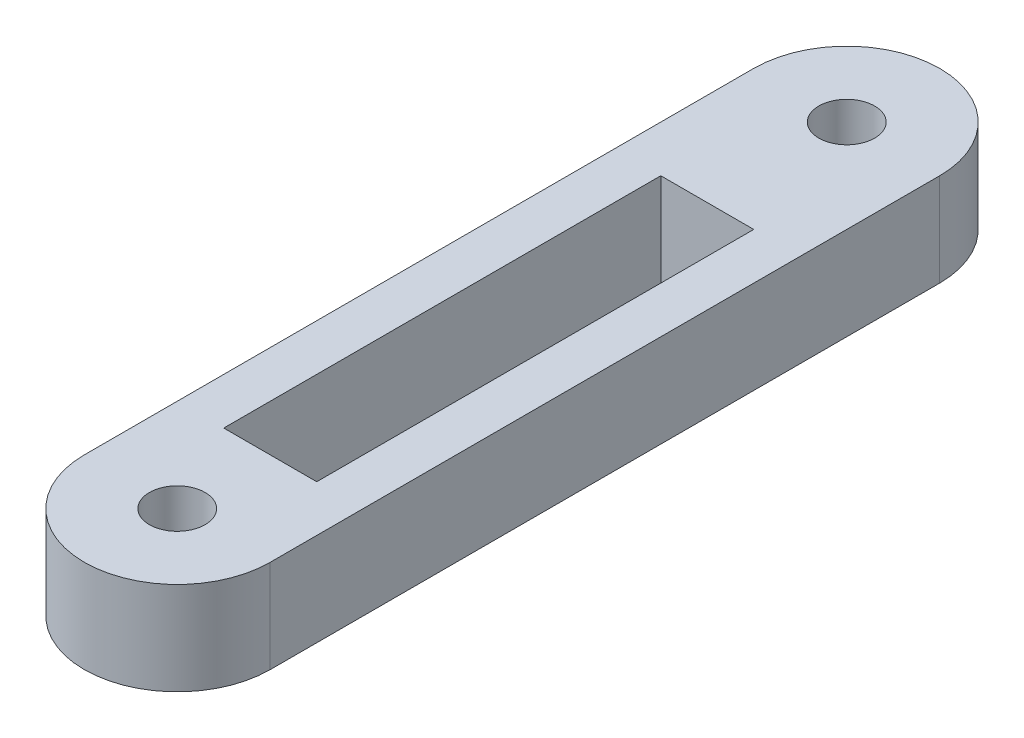
ISO-10303-21;
HEADER;
FILE_DESCRIPTION(('STEP AP214'),'2;1');
FILE_NAME('part.step','',(''),(''),'','','');
FILE_SCHEMA(('AUTOMOTIVE_DESIGN { 1 0 10303 214 1 1 1 1 }'));
ENDSEC;
DATA;
#1=APPLICATION_CONTEXT('core data for automotive mechanical design processes');
#2=APPLICATION_PROTOCOL_DEFINITION('international standard','automotive_design',2000,#1);
#3=PRODUCT_CONTEXT('',#1,'mechanical');
#4=PRODUCT('Part','Part','',(#3));
#5=PRODUCT_RELATED_PRODUCT_CATEGORY('part','',(#4));
#6=PRODUCT_DEFINITION_FORMATION('','',#4);
#7=PRODUCT_DEFINITION_CONTEXT('part definition',#1,'design');
#8=PRODUCT_DEFINITION('design','',#6,#7);
#9=PRODUCT_DEFINITION_SHAPE('','',#8);
#10=(LENGTH_UNIT() NAMED_UNIT(*) SI_UNIT(.MILLI.,.METRE.));
#11=(NAMED_UNIT(*) PLANE_ANGLE_UNIT() SI_UNIT($,.RADIAN.));
#12=(NAMED_UNIT(*) SI_UNIT($,.STERADIAN.) SOLID_ANGLE_UNIT());
#13=UNCERTAINTY_MEASURE_WITH_UNIT(LENGTH_MEASURE(1.E-05),#10,'distance_accuracy_value','');
#14=(GEOMETRIC_REPRESENTATION_CONTEXT(3) GLOBAL_UNCERTAINTY_ASSIGNED_CONTEXT((#13)) GLOBAL_UNIT_ASSIGNED_CONTEXT((#10,
#11,#12)) REPRESENTATION_CONTEXT('',''));
#15=CARTESIAN_POINT('',(0.,0.,0.));
#16=DIRECTION('',(0.,0.,1.));
#17=DIRECTION('',(1.,0.,0.));
#18=AXIS2_PLACEMENT_3D('',#15,#16,#17);
#19=CARTESIAN_POINT('',(0.,5.,-18.));
#20=DIRECTION('',(0.,-1.,0.));
#21=DIRECTION('',(0.,0.,-1.));
#22=AXIS2_PLACEMENT_3D('',#19,#20,#21);
#23=CYLINDRICAL_SURFACE('',#22,4.99999999999999);
#24=CARTESIAN_POINT('',(0.,0.,-18.));
#25=DIRECTION('',(0.,1.,0.));
#26=DIRECTION('',(0.,0.,1.));
#27=AXIS2_PLACEMENT_3D('',#24,#25,#26);
#28=CIRCLE('',#27,4.99999999999999);
#29=CARTESIAN_POINT('',(4.99999999999999,0.,-18.));
#30=VERTEX_POINT('',#29);
#31=CARTESIAN_POINT('',(-5.,0.,-18.));
#32=VERTEX_POINT('',#31);
#33=EDGE_CURVE('E136',#30,#32,#28,.T.);
#34=ORIENTED_EDGE('',*,*,#33,.T.);
#35=DIRECTION('',(0.,-1.,0.));
#36=VECTOR('',#35,1.);
#37=CARTESIAN_POINT('',(-5.,5.,-18.));
#38=LINE('',#37,#36);
#39=CARTESIAN_POINT('',(-5.,5.,-18.));
#40=VERTEX_POINT('',#39);
#41=EDGE_CURVE('E11',#40,#32,#38,.T.);
#42=ORIENTED_EDGE('',*,*,#41,.F.);
#43=CARTESIAN_POINT('',(0.,5.,-18.));
#44=DIRECTION('',(0.,1.,0.));
#45=DIRECTION('',(0.,0.,1.));
#46=AXIS2_PLACEMENT_3D('',#43,#44,#45);
#47=CIRCLE('',#46,4.99999999999999);
#48=CARTESIAN_POINT('',(4.99999999999999,5.,-18.));
#49=VERTEX_POINT('',#48);
#50=EDGE_CURVE('E140',#49,#40,#47,.T.);
#51=ORIENTED_EDGE('',*,*,#50,.F.);
#52=DIRECTION('',(0.,-1.,0.));
#53=VECTOR('',#52,1.);
#54=CARTESIAN_POINT('',(4.99999999999999,5.,-18.));
#55=LINE('',#54,#53);
#56=EDGE_CURVE('E150',#49,#30,#55,.T.);
#57=ORIENTED_EDGE('',*,*,#56,.T.);
#58=EDGE_LOOP('',(#34,#42,#51,#57));
#59=FACE_BOUND('',#58,.T.);
#60=ADVANCED_FACE('F35',(#59),#23,.T.);
#61=CARTESIAN_POINT('',(-5.,5.,-18.));
#62=DIRECTION('',(1.,0.,0.));
#63=DIRECTION('',(0.,0.,-1.));
#64=AXIS2_PLACEMENT_3D('',#61,#62,#63);
#65=PLANE('',#64);
#66=DIRECTION('',(0.,0.,1.));
#67=VECTOR('',#66,1.);
#68=CARTESIAN_POINT('',(-5.,0.,-18.));
#69=LINE('',#68,#67);
#70=CARTESIAN_POINT('',(-4.99999999999999,0.,18.));
#71=VERTEX_POINT('',#70);
#72=EDGE_CURVE('E153',#32,#71,#69,.T.);
#73=ORIENTED_EDGE('',*,*,#72,.T.);
#74=DIRECTION('',(0.,-1.,0.));
#75=VECTOR('',#74,1.);
#76=CARTESIAN_POINT('',(-4.99999999999999,5.,18.));
#77=LINE('',#76,#75);
#78=CARTESIAN_POINT('',(-4.99999999999999,5.,18.));
#79=VERTEX_POINT('',#78);
#80=EDGE_CURVE('E42',#79,#71,#77,.T.);
#81=ORIENTED_EDGE('',*,*,#80,.F.);
#82=DIRECTION('',(0.,0.,1.));
#83=VECTOR('',#82,1.);
#84=CARTESIAN_POINT('',(-5.,5.,-18.));
#85=LINE('',#84,#83);
#86=EDGE_CURVE('E143',#40,#79,#85,.T.);
#87=ORIENTED_EDGE('',*,*,#86,.F.);
#88=ORIENTED_EDGE('',*,*,#41,.T.);
#89=EDGE_LOOP('',(#73,#81,#87,#88));
#90=FACE_BOUND('',#89,.T.);
#91=ADVANCED_FACE('F181',(#90),#65,.F.);
#92=CARTESIAN_POINT('',(0.,5.,18.));
#93=DIRECTION('',(0.,-1.,0.));
#94=DIRECTION('',(0.,0.,-1.));
#95=AXIS2_PLACEMENT_3D('',#92,#93,#94);
#96=CYLINDRICAL_SURFACE('',#95,4.99999999999999);
#97=CARTESIAN_POINT('',(0.,0.,18.));
#98=DIRECTION('',(0.,1.,0.));
#99=DIRECTION('',(0.,0.,1.));
#100=AXIS2_PLACEMENT_3D('',#97,#98,#99);
#101=CIRCLE('',#100,4.99999999999999);
#102=CARTESIAN_POINT('',(5.,0.,18.));
#103=VERTEX_POINT('',#102);
#104=EDGE_CURVE('E155',#71,#103,#101,.T.);
#105=ORIENTED_EDGE('',*,*,#104,.T.);
#106=DIRECTION('',(0.,-1.,0.));
#107=VECTOR('',#106,1.);
#108=CARTESIAN_POINT('',(5.,5.,18.));
#109=LINE('',#108,#107);
#110=CARTESIAN_POINT('',(5.,5.,18.));
#111=VERTEX_POINT('',#110);
#112=EDGE_CURVE('E160',#111,#103,#109,.T.);
#113=ORIENTED_EDGE('',*,*,#112,.F.);
#114=CARTESIAN_POINT('',(0.,5.,18.));
#115=DIRECTION('',(0.,1.,0.));
#116=DIRECTION('',(0.,0.,1.));
#117=AXIS2_PLACEMENT_3D('',#114,#115,#116);
#118=CIRCLE('',#117,4.99999999999999);
#119=EDGE_CURVE('E146',#79,#111,#118,.T.);
#120=ORIENTED_EDGE('',*,*,#119,.F.);
#121=ORIENTED_EDGE('',*,*,#80,.T.);
#122=EDGE_LOOP('',(#105,#113,#120,#121));
#123=FACE_BOUND('',#122,.T.);
#124=ADVANCED_FACE('F167',(#123),#96,.T.);
#125=CARTESIAN_POINT('',(4.99999999999999,5.,-18.));
#126=DIRECTION('',(-1.,0.,0.));
#127=DIRECTION('',(0.,0.,1.));
#128=AXIS2_PLACEMENT_3D('',#125,#126,#127);
#129=PLANE('',#128);
#130=DIRECTION('',(0.,0.,-1.));
#131=VECTOR('',#130,1.);
#132=CARTESIAN_POINT('',(4.99999999999999,0.,-18.));
#133=LINE('',#132,#131);
#134=EDGE_CURVE('E144',#103,#30,#133,.T.);
#135=ORIENTED_EDGE('',*,*,#134,.T.);
#136=ORIENTED_EDGE('',*,*,#56,.F.);
#137=DIRECTION('',(0.,0.,-1.));
#138=VECTOR('',#137,1.);
#139=CARTESIAN_POINT('',(4.99999999999999,5.,-18.));
#140=LINE('',#139,#138);
#141=EDGE_CURVE('E148',#111,#49,#140,.T.);
#142=ORIENTED_EDGE('',*,*,#141,.F.);
#143=ORIENTED_EDGE('',*,*,#112,.T.);
#144=EDGE_LOOP('',(#135,#136,#142,#143));
#145=FACE_BOUND('',#144,.T.);
#146=ADVANCED_FACE('F176',(#145),#129,.F.);
#147=CARTESIAN_POINT('',(0.,5.,-18.));
#148=DIRECTION('',(0.,1.,0.));
#149=DIRECTION('',(0.,0.,1.));
#150=AXIS2_PLACEMENT_3D('',#147,#148,#149);
#151=PLANE('',#150);
#152=CARTESIAN_POINT('',(0.,5.,18.));
#153=DIRECTION('',(0.,-1.,0.));
#154=DIRECTION('',(0.,0.,-1.));
#155=AXIS2_PLACEMENT_3D('',#152,#153,#154);
#156=CIRCLE('',#155,1.5);
#157=CARTESIAN_POINT('',(0.,5.,16.5));
#158=VERTEX_POINT('',#157);
#159=EDGE_CURVE('E130',#158,#158,#156,.T.);
#160=ORIENTED_EDGE('',*,*,#159,.T.);
#161=EDGE_LOOP('',(#160));
#162=FACE_BOUND('',#161,.T.);
#163=CARTESIAN_POINT('',(0.,5.,-18.));
#164=DIRECTION('',(0.,-1.,0.));
#165=DIRECTION('',(0.,0.,1.));
#166=AXIS2_PLACEMENT_3D('',#163,#164,#165);
#167=CIRCLE('',#166,1.5);
#168=CARTESIAN_POINT('',(0.,5.,-16.5));
#169=VERTEX_POINT('',#168);
#170=EDGE_CURVE('E223',#169,#169,#167,.T.);
#171=ORIENTED_EDGE('',*,*,#170,.T.);
#172=EDGE_LOOP('',(#171));
#173=FACE_BOUND('',#172,.T.);
#174=DIRECTION('',(0.,0.,1.));
#175=VECTOR('',#174,1.);
#176=CARTESIAN_POINT('',(2.5,5.,-10.5));
#177=LINE('',#176,#175);
#178=CARTESIAN_POINT('',(2.5,5.,-10.5));
#179=VERTEX_POINT('',#178);
#180=CARTESIAN_POINT('',(2.5,5.,13.));
#181=VERTEX_POINT('',#180);
#182=EDGE_CURVE('E101',#179,#181,#177,.T.);
#183=ORIENTED_EDGE('',*,*,#182,.T.);
#184=DIRECTION('',(-1.,0.,0.));
#185=VECTOR('',#184,1.);
#186=CARTESIAN_POINT('',(-2.5,5.,13.));
#187=LINE('',#186,#185);
#188=CARTESIAN_POINT('',(-2.5,5.,13.));
#189=VERTEX_POINT('',#188);
#190=EDGE_CURVE('E110',#181,#189,#187,.T.);
#191=ORIENTED_EDGE('',*,*,#190,.T.);
#192=DIRECTION('',(0.,0.,-1.));
#193=VECTOR('',#192,1.);
#194=CARTESIAN_POINT('',(-2.5,5.,-10.5));
#195=LINE('',#194,#193);
#196=CARTESIAN_POINT('',(-2.5,5.,-10.5));
#197=VERTEX_POINT('',#196);
#198=EDGE_CURVE('E49',#189,#197,#195,.T.);
#199=ORIENTED_EDGE('',*,*,#198,.T.);
#200=DIRECTION('',(1.,0.,0.));
#201=VECTOR('',#200,1.);
#202=CARTESIAN_POINT('',(-2.5,5.,-10.5));
#203=LINE('',#202,#201);
#204=EDGE_CURVE('E107',#197,#179,#203,.T.);
#205=ORIENTED_EDGE('',*,*,#204,.T.);
#206=EDGE_LOOP('',(#183,#191,#199,#205));
#207=FACE_BOUND('',#206,.T.);
#208=ORIENTED_EDGE('',*,*,#50,.T.);
#209=ORIENTED_EDGE('',*,*,#86,.T.);
#210=ORIENTED_EDGE('',*,*,#119,.T.);
#211=ORIENTED_EDGE('',*,*,#141,.T.);
#212=EDGE_LOOP('',(#208,#209,#210,#211));
#213=FACE_BOUND('',#212,.T.);
#214=ADVANCED_FACE('F114',(#162,#173,#207,#213),#151,.T.);
#215=CARTESIAN_POINT('',(0.,0.,-18.));
#216=DIRECTION('',(0.,1.,0.));
#217=DIRECTION('',(0.,0.,1.));
#218=AXIS2_PLACEMENT_3D('',#215,#216,#217);
#219=PLANE('',#218);
#220=CARTESIAN_POINT('',(0.,0.,18.));
#221=DIRECTION('',(0.,-1.,0.));
#222=DIRECTION('',(0.,0.,-1.));
#223=AXIS2_PLACEMENT_3D('',#220,#221,#222);
#224=CIRCLE('',#223,1.5);
#225=CARTESIAN_POINT('',(0.,0.,16.5));
#226=VERTEX_POINT('',#225);
#227=EDGE_CURVE('E222',#226,#226,#224,.T.);
#228=ORIENTED_EDGE('',*,*,#227,.F.);
#229=EDGE_LOOP('',(#228));
#230=FACE_BOUND('',#229,.T.);
#231=CARTESIAN_POINT('',(0.,0.,-18.));
#232=DIRECTION('',(0.,-1.,0.));
#233=DIRECTION('',(0.,0.,1.));
#234=AXIS2_PLACEMENT_3D('',#231,#232,#233);
#235=CIRCLE('',#234,1.5);
#236=CARTESIAN_POINT('',(0.,0.,-16.5));
#237=VERTEX_POINT('',#236);
#238=EDGE_CURVE('E123',#237,#237,#235,.T.);
#239=ORIENTED_EDGE('',*,*,#238,.F.);
#240=EDGE_LOOP('',(#239));
#241=FACE_BOUND('',#240,.T.);
#242=DIRECTION('',(-1.,0.,0.));
#243=VECTOR('',#242,1.);
#244=CARTESIAN_POINT('',(-2.5,0.,13.));
#245=LINE('',#244,#243);
#246=CARTESIAN_POINT('',(2.5,0.,13.));
#247=VERTEX_POINT('',#246);
#248=CARTESIAN_POINT('',(-2.5,0.,13.));
#249=VERTEX_POINT('',#248);
#250=EDGE_CURVE('E129',#247,#249,#245,.T.);
#251=ORIENTED_EDGE('',*,*,#250,.F.);
#252=DIRECTION('',(0.,0.,1.));
#253=VECTOR('',#252,1.);
#254=CARTESIAN_POINT('',(2.5,0.,-10.5));
#255=LINE('',#254,#253);
#256=CARTESIAN_POINT('',(2.5,0.,-10.5));
#257=VERTEX_POINT('',#256);
#258=EDGE_CURVE('E57',#257,#247,#255,.T.);
#259=ORIENTED_EDGE('',*,*,#258,.F.);
#260=DIRECTION('',(1.,0.,0.));
#261=VECTOR('',#260,1.);
#262=CARTESIAN_POINT('',(-2.5,0.,-10.5));
#263=LINE('',#262,#261);
#264=CARTESIAN_POINT('',(-2.5,0.,-10.5));
#265=VERTEX_POINT('',#264);
#266=EDGE_CURVE('E117',#265,#257,#263,.T.);
#267=ORIENTED_EDGE('',*,*,#266,.F.);
#268=DIRECTION('',(0.,0.,-1.));
#269=VECTOR('',#268,1.);
#270=CARTESIAN_POINT('',(-2.5,0.,-10.5));
#271=LINE('',#270,#269);
#272=EDGE_CURVE('E120',#249,#265,#271,.T.);
#273=ORIENTED_EDGE('',*,*,#272,.F.);
#274=EDGE_LOOP('',(#251,#259,#267,#273));
#275=FACE_BOUND('',#274,.T.);
#276=ORIENTED_EDGE('',*,*,#33,.F.);
#277=ORIENTED_EDGE('',*,*,#134,.F.);
#278=ORIENTED_EDGE('',*,*,#104,.F.);
#279=ORIENTED_EDGE('',*,*,#72,.F.);
#280=EDGE_LOOP('',(#276,#277,#278,#279));
#281=FACE_BOUND('',#280,.T.);
#282=ADVANCED_FACE('F173',(#230,#241,#275,#281),#219,.F.);
#283=CARTESIAN_POINT('',(2.5,5.,-10.5));
#284=DIRECTION('',(1.,0.,0.));
#285=DIRECTION('',(0.,0.,-1.));
#286=AXIS2_PLACEMENT_3D('',#283,#284,#285);
#287=PLANE('',#286);
#288=ORIENTED_EDGE('',*,*,#258,.T.);
#289=DIRECTION('',(0.,-1.,0.));
#290=VECTOR('',#289,1.);
#291=CARTESIAN_POINT('',(2.5,5.,13.));
#292=LINE('',#291,#290);
#293=EDGE_CURVE('E97',#181,#247,#292,.T.);
#294=ORIENTED_EDGE('',*,*,#293,.F.);
#295=ORIENTED_EDGE('',*,*,#182,.F.);
#296=DIRECTION('',(0.,-1.,0.));
#297=VECTOR('',#296,1.);
#298=CARTESIAN_POINT('',(2.5,5.,-10.5));
#299=LINE('',#298,#297);
#300=EDGE_CURVE('E134',#179,#257,#299,.T.);
#301=ORIENTED_EDGE('',*,*,#300,.T.);
#302=EDGE_LOOP('',(#288,#294,#295,#301));
#303=FACE_BOUND('',#302,.T.);
#304=ADVANCED_FACE('F99',(#303),#287,.F.);
#305=CARTESIAN_POINT('',(-2.5,5.,-10.5));
#306=DIRECTION('',(0.,0.,-1.));
#307=DIRECTION('',(-1.,0.,0.));
#308=AXIS2_PLACEMENT_3D('',#305,#306,#307);
#309=PLANE('',#308);
#310=ORIENTED_EDGE('',*,*,#266,.T.);
#311=ORIENTED_EDGE('',*,*,#300,.F.);
#312=ORIENTED_EDGE('',*,*,#204,.F.);
#313=DIRECTION('',(0.,-1.,0.));
#314=VECTOR('',#313,1.);
#315=CARTESIAN_POINT('',(-2.5,5.,-10.5));
#316=LINE('',#315,#314);
#317=EDGE_CURVE('E137',#197,#265,#316,.T.);
#318=ORIENTED_EDGE('',*,*,#317,.T.);
#319=EDGE_LOOP('',(#310,#311,#312,#318));
#320=FACE_BOUND('',#319,.T.);
#321=ADVANCED_FACE('F199',(#320),#309,.F.);
#322=CARTESIAN_POINT('',(-2.5,5.,-10.5));
#323=DIRECTION('',(-1.,0.,0.));
#324=DIRECTION('',(0.,0.,1.));
#325=AXIS2_PLACEMENT_3D('',#322,#323,#324);
#326=PLANE('',#325);
#327=ORIENTED_EDGE('',*,*,#272,.T.);
#328=ORIENTED_EDGE('',*,*,#317,.F.);
#329=ORIENTED_EDGE('',*,*,#198,.F.);
#330=DIRECTION('',(0.,-1.,0.));
#331=VECTOR('',#330,1.);
#332=CARTESIAN_POINT('',(-2.5,5.,13.));
#333=LINE('',#332,#331);
#334=EDGE_CURVE('E106',#189,#249,#333,.T.);
#335=ORIENTED_EDGE('',*,*,#334,.T.);
#336=EDGE_LOOP('',(#327,#328,#329,#335));
#337=FACE_BOUND('',#336,.T.);
#338=ADVANCED_FACE('F203',(#337),#326,.F.);
#339=CARTESIAN_POINT('',(-2.5,5.,13.));
#340=DIRECTION('',(0.,0.,1.));
#341=DIRECTION('',(1.,0.,0.));
#342=AXIS2_PLACEMENT_3D('',#339,#340,#341);
#343=PLANE('',#342);
#344=ORIENTED_EDGE('',*,*,#250,.T.);
#345=ORIENTED_EDGE('',*,*,#334,.F.);
#346=ORIENTED_EDGE('',*,*,#190,.F.);
#347=ORIENTED_EDGE('',*,*,#293,.T.);
#348=EDGE_LOOP('',(#344,#345,#346,#347));
#349=FACE_BOUND('',#348,.T.);
#350=ADVANCED_FACE('F111',(#349),#343,.F.);
#351=CARTESIAN_POINT('',(0.,5.,-18.));
#352=DIRECTION('',(0.,-1.,0.));
#353=DIRECTION('',(0.,0.,-1.));
#354=AXIS2_PLACEMENT_3D('',#351,#352,#353);
#355=CYLINDRICAL_SURFACE('',#354,1.5);
#356=ORIENTED_EDGE('',*,*,#170,.F.);
#357=EDGE_LOOP('',(#356));
#358=FACE_BOUND('',#357,.T.);
#359=ORIENTED_EDGE('',*,*,#238,.T.);
#360=EDGE_LOOP('',(#359));
#361=FACE_BOUND('',#360,.T.);
#362=ADVANCED_FACE('F202',(#358,#361),#355,.F.);
#363=CARTESIAN_POINT('',(0.,5.,18.));
#364=DIRECTION('',(0.,-1.,0.));
#365=DIRECTION('',(0.,0.,-1.));
#366=AXIS2_PLACEMENT_3D('',#363,#364,#365);
#367=CYLINDRICAL_SURFACE('',#366,1.5);
#368=ORIENTED_EDGE('',*,*,#159,.F.);
#369=EDGE_LOOP('',(#368));
#370=FACE_BOUND('',#369,.T.);
#371=ORIENTED_EDGE('',*,*,#227,.T.);
#372=EDGE_LOOP('',(#371));
#373=FACE_BOUND('',#372,.T.);
#374=ADVANCED_FACE('F211',(#370,#373),#367,.F.);
#375=CLOSED_SHELL('',(#60,#91,#124,#146,#214,#282,#304,#321,#338,#350,#362,#374));
#376=MANIFOLD_SOLID_BREP('B2',#375);
#377=ADVANCED_BREP_SHAPE_REPRESENTATION('',(#18,#376),#14);
#378=SHAPE_DEFINITION_REPRESENTATION(#9,#377);
ENDSEC;
END-ISO-10303-21;
